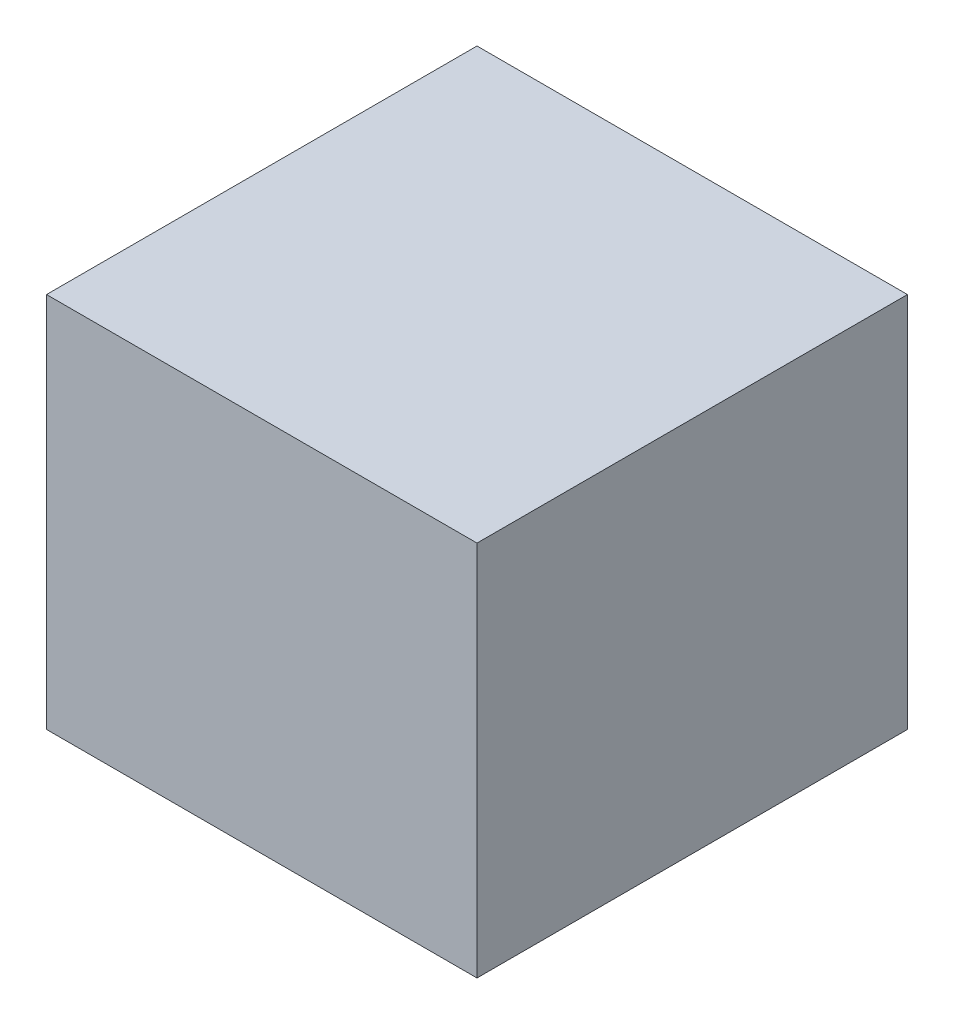
ISO-10303-21;
HEADER;
FILE_DESCRIPTION(('STEP AP214'),'2;1');
FILE_NAME('part.step','',(''),(''),'','','');
FILE_SCHEMA(('AUTOMOTIVE_DESIGN { 1 0 10303 214 1 1 1 1 }'));
ENDSEC;
DATA;
#1=APPLICATION_CONTEXT('core data for automotive mechanical design processes');
#2=APPLICATION_PROTOCOL_DEFINITION('international standard','automotive_design',2000,#1);
#3=PRODUCT_CONTEXT('',#1,'mechanical');
#4=PRODUCT('Part','Part','',(#3));
#5=PRODUCT_RELATED_PRODUCT_CATEGORY('part','',(#4));
#6=PRODUCT_DEFINITION_FORMATION('','',#4);
#7=PRODUCT_DEFINITION_CONTEXT('part definition',#1,'design');
#8=PRODUCT_DEFINITION('design','',#6,#7);
#9=PRODUCT_DEFINITION_SHAPE('','',#8);
#10=(LENGTH_UNIT() NAMED_UNIT(*) SI_UNIT(.MILLI.,.METRE.));
#11=(NAMED_UNIT(*) PLANE_ANGLE_UNIT() SI_UNIT($,.RADIAN.));
#12=(NAMED_UNIT(*) SI_UNIT($,.STERADIAN.) SOLID_ANGLE_UNIT());
#13=UNCERTAINTY_MEASURE_WITH_UNIT(LENGTH_MEASURE(1.E-05),#10,'distance_accuracy_value','');
#14=(GEOMETRIC_REPRESENTATION_CONTEXT(3) GLOBAL_UNCERTAINTY_ASSIGNED_CONTEXT((#13)) GLOBAL_UNIT_ASSIGNED_CONTEXT((#10,
#11,#12)) REPRESENTATION_CONTEXT('',''));
#15=CARTESIAN_POINT('',(0.,0.,0.));
#16=DIRECTION('',(0.,0.,1.));
#17=DIRECTION('',(1.,0.,0.));
#18=AXIS2_PLACEMENT_3D('',#15,#16,#17);
#19=CARTESIAN_POINT('',(0.,0.,400.));
#20=DIRECTION('',(1.,0.,0.));
#21=DIRECTION('',(0.,0.,-1.));
#22=AXIS2_PLACEMENT_3D('',#19,#20,#21);
#23=PLANE('',#22);
#24=DIRECTION('',(0.,-1.,0.));
#25=VECTOR('',#24,1.);
#26=CARTESIAN_POINT('',(0.,0.,0.));
#27=LINE('',#26,#25);
#28=CARTESIAN_POINT('',(0.,350.,0.));
#29=VERTEX_POINT('',#28);
#30=CARTESIAN_POINT('',(0.,0.,0.));
#31=VERTEX_POINT('',#30);
#32=EDGE_CURVE('E115',#29,#31,#27,.T.);
#33=ORIENTED_EDGE('',*,*,#32,.T.);
#34=DIRECTION('',(0.,0.,-1.));
#35=VECTOR('',#34,1.);
#36=CARTESIAN_POINT('',(0.,0.,400.));
#37=LINE('',#36,#35);
#38=CARTESIAN_POINT('',(0.,0.,400.));
#39=VERTEX_POINT('',#38);
#40=EDGE_CURVE('E11',#39,#31,#37,.T.);
#41=ORIENTED_EDGE('',*,*,#40,.F.);
#42=DIRECTION('',(0.,-1.,0.));
#43=VECTOR('',#42,1.);
#44=CARTESIAN_POINT('',(0.,0.,400.));
#45=LINE('',#44,#43);
#46=CARTESIAN_POINT('',(0.,350.,400.));
#47=VERTEX_POINT('',#46);
#48=EDGE_CURVE('E97',#47,#39,#45,.T.);
#49=ORIENTED_EDGE('',*,*,#48,.F.);
#50=DIRECTION('',(0.,0.,-1.));
#51=VECTOR('',#50,1.);
#52=CARTESIAN_POINT('',(0.,350.,400.));
#53=LINE('',#52,#51);
#54=EDGE_CURVE('E111',#47,#29,#53,.T.);
#55=ORIENTED_EDGE('',*,*,#54,.T.);
#56=EDGE_LOOP('',(#33,#41,#49,#55));
#57=FACE_BOUND('',#56,.T.);
#58=ADVANCED_FACE('F45',(#57),#23,.F.);
#59=CARTESIAN_POINT('',(0.,0.,400.));
#60=DIRECTION('',(0.,1.,0.));
#61=DIRECTION('',(0.,0.,1.));
#62=AXIS2_PLACEMENT_3D('',#59,#60,#61);
#63=PLANE('',#62);
#64=DIRECTION('',(1.,0.,0.));
#65=VECTOR('',#64,1.);
#66=CARTESIAN_POINT('',(0.,0.,0.));
#67=LINE('',#66,#65);
#68=CARTESIAN_POINT('',(400.,0.,0.));
#69=VERTEX_POINT('',#68);
#70=EDGE_CURVE('E102',#31,#69,#67,.T.);
#71=ORIENTED_EDGE('',*,*,#70,.T.);
#72=DIRECTION('',(0.,0.,-1.));
#73=VECTOR('',#72,1.);
#74=CARTESIAN_POINT('',(400.,0.,400.));
#75=LINE('',#74,#73);
#76=CARTESIAN_POINT('',(400.,0.,400.));
#77=VERTEX_POINT('',#76);
#78=EDGE_CURVE('E54',#77,#69,#75,.T.);
#79=ORIENTED_EDGE('',*,*,#78,.F.);
#80=DIRECTION('',(1.,0.,0.));
#81=VECTOR('',#80,1.);
#82=CARTESIAN_POINT('',(0.,0.,400.));
#83=LINE('',#82,#81);
#84=EDGE_CURVE('E92',#39,#77,#83,.T.);
#85=ORIENTED_EDGE('',*,*,#84,.F.);
#86=ORIENTED_EDGE('',*,*,#40,.T.);
#87=EDGE_LOOP('',(#71,#79,#85,#86));
#88=FACE_BOUND('',#87,.T.);
#89=ADVANCED_FACE('F101',(#88),#63,.F.);
#90=CARTESIAN_POINT('',(400.,0.,400.));
#91=DIRECTION('',(-1.,0.,0.));
#92=DIRECTION('',(0.,0.,1.));
#93=AXIS2_PLACEMENT_3D('',#90,#91,#92);
#94=PLANE('',#93);
#95=DIRECTION('',(0.,1.,0.));
#96=VECTOR('',#95,1.);
#97=CARTESIAN_POINT('',(400.,0.,0.));
#98=LINE('',#97,#96);
#99=CARTESIAN_POINT('',(400.,350.,0.));
#100=VERTEX_POINT('',#99);
#101=EDGE_CURVE('E79',#69,#100,#98,.T.);
#102=ORIENTED_EDGE('',*,*,#101,.T.);
#103=DIRECTION('',(0.,0.,-1.));
#104=VECTOR('',#103,1.);
#105=CARTESIAN_POINT('',(400.,350.,400.));
#106=LINE('',#105,#104);
#107=CARTESIAN_POINT('',(400.,350.,400.));
#108=VERTEX_POINT('',#107);
#109=EDGE_CURVE('E104',#108,#100,#106,.T.);
#110=ORIENTED_EDGE('',*,*,#109,.F.);
#111=DIRECTION('',(0.,1.,0.));
#112=VECTOR('',#111,1.);
#113=CARTESIAN_POINT('',(400.,0.,400.));
#114=LINE('',#113,#112);
#115=EDGE_CURVE('E95',#77,#108,#114,.T.);
#116=ORIENTED_EDGE('',*,*,#115,.F.);
#117=ORIENTED_EDGE('',*,*,#78,.T.);
#118=EDGE_LOOP('',(#102,#110,#116,#117));
#119=FACE_BOUND('',#118,.T.);
#120=ADVANCED_FACE('F105',(#119),#94,.F.);
#121=CARTESIAN_POINT('',(0.,350.,400.));
#122=DIRECTION('',(0.,-1.,0.));
#123=DIRECTION('',(0.,0.,-1.));
#124=AXIS2_PLACEMENT_3D('',#121,#122,#123);
#125=PLANE('',#124);
#126=DIRECTION('',(-1.,0.,0.));
#127=VECTOR('',#126,1.);
#128=CARTESIAN_POINT('',(0.,350.,0.));
#129=LINE('',#128,#127);
#130=EDGE_CURVE('E85',#100,#29,#129,.T.);
#131=ORIENTED_EDGE('',*,*,#130,.T.);
#132=ORIENTED_EDGE('',*,*,#54,.F.);
#133=DIRECTION('',(-1.,0.,0.));
#134=VECTOR('',#133,1.);
#135=CARTESIAN_POINT('',(0.,350.,400.));
#136=LINE('',#135,#134);
#137=EDGE_CURVE('E62',#108,#47,#136,.T.);
#138=ORIENTED_EDGE('',*,*,#137,.F.);
#139=ORIENTED_EDGE('',*,*,#109,.T.);
#140=EDGE_LOOP('',(#131,#132,#138,#139));
#141=FACE_BOUND('',#140,.T.);
#142=ADVANCED_FACE('F130',(#141),#125,.F.);
#143=CARTESIAN_POINT('',(0.,0.,400.));
#144=DIRECTION('',(0.,0.,-1.));
#145=DIRECTION('',(-1.,0.,0.));
#146=AXIS2_PLACEMENT_3D('',#143,#144,#145);
#147=PLANE('',#146);
#148=ORIENTED_EDGE('',*,*,#48,.T.);
#149=ORIENTED_EDGE('',*,*,#84,.T.);
#150=ORIENTED_EDGE('',*,*,#115,.T.);
#151=ORIENTED_EDGE('',*,*,#137,.T.);
#152=EDGE_LOOP('',(#148,#149,#150,#151));
#153=FACE_BOUND('',#152,.T.);
#154=ADVANCED_FACE('F93',(#153),#147,.F.);
#155=CARTESIAN_POINT('',(0.,0.,0.));
#156=DIRECTION('',(0.,0.,-1.));
#157=DIRECTION('',(-1.,0.,0.));
#158=AXIS2_PLACEMENT_3D('',#155,#156,#157);
#159=PLANE('',#158);
#160=ORIENTED_EDGE('',*,*,#32,.F.);
#161=ORIENTED_EDGE('',*,*,#130,.F.);
#162=ORIENTED_EDGE('',*,*,#101,.F.);
#163=ORIENTED_EDGE('',*,*,#70,.F.);
#164=EDGE_LOOP('',(#160,#161,#162,#163));
#165=FACE_BOUND('',#164,.T.);
#166=ADVANCED_FACE('F133',(#165),#159,.T.);
#167=CLOSED_SHELL('',(#58,#89,#120,#142,#154,#166));
#168=MANIFOLD_SOLID_BREP('B2',#167);
#169=ADVANCED_BREP_SHAPE_REPRESENTATION('',(#18,#168),#14);
#170=SHAPE_DEFINITION_REPRESENTATION(#9,#169);
ENDSEC;
END-ISO-10303-21;
